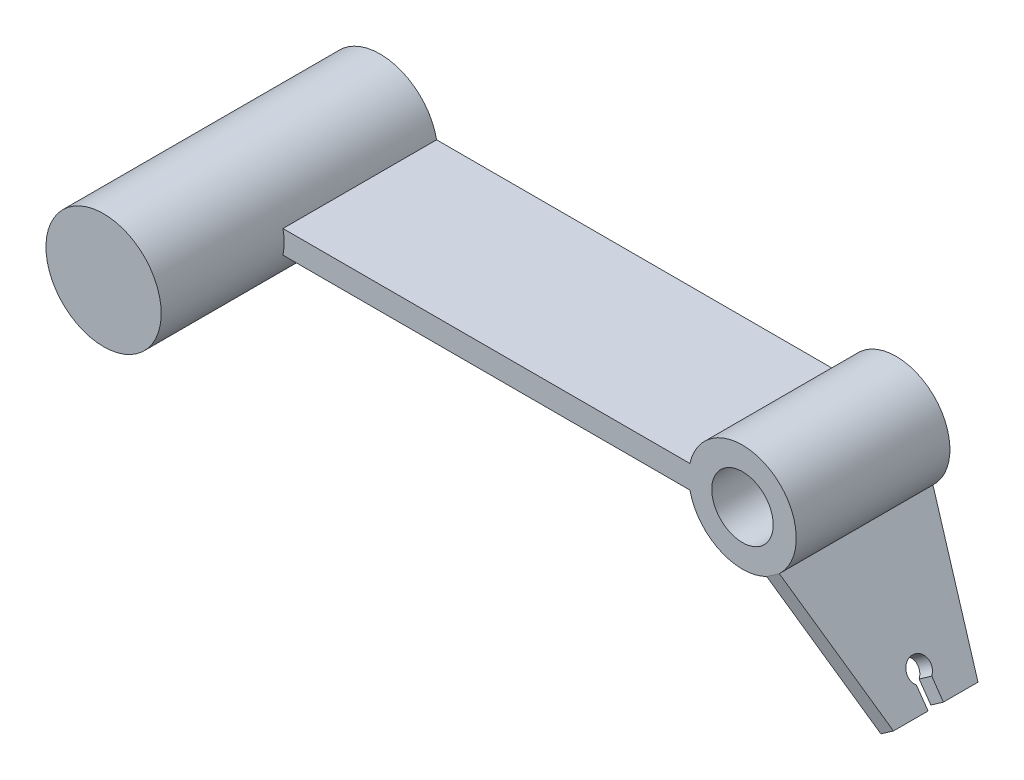
ISO-10303-21;
HEADER;
FILE_DESCRIPTION(('STEP AP214'),'2;1');
FILE_NAME('part.step','',(''),(''),'','','');
FILE_SCHEMA(('AUTOMOTIVE_DESIGN { 1 0 10303 214 1 1 1 1 }'));
ENDSEC;
DATA;
#1=APPLICATION_CONTEXT('core data for automotive mechanical design processes');
#2=APPLICATION_PROTOCOL_DEFINITION('international standard','automotive_design',2000,#1);
#3=PRODUCT_CONTEXT('',#1,'mechanical');
#4=PRODUCT('Part','Part','',(#3));
#5=PRODUCT_RELATED_PRODUCT_CATEGORY('part','',(#4));
#6=PRODUCT_DEFINITION_FORMATION('','',#4);
#7=PRODUCT_DEFINITION_CONTEXT('part definition',#1,'design');
#8=PRODUCT_DEFINITION('design','',#6,#7);
#9=PRODUCT_DEFINITION_SHAPE('','',#8);
#10=(LENGTH_UNIT() NAMED_UNIT(*) SI_UNIT(.MILLI.,.METRE.));
#11=(NAMED_UNIT(*) PLANE_ANGLE_UNIT() SI_UNIT($,.RADIAN.));
#12=(NAMED_UNIT(*) SI_UNIT($,.STERADIAN.) SOLID_ANGLE_UNIT());
#13=UNCERTAINTY_MEASURE_WITH_UNIT(LENGTH_MEASURE(1.E-05),#10,'distance_accuracy_value','');
#14=(GEOMETRIC_REPRESENTATION_CONTEXT(3) GLOBAL_UNCERTAINTY_ASSIGNED_CONTEXT((#13)) GLOBAL_UNIT_ASSIGNED_CONTEXT((#10,
#11,#12)) REPRESENTATION_CONTEXT('',''));
#15=CARTESIAN_POINT('',(0.,0.,0.));
#16=DIRECTION('',(0.,0.,1.));
#17=DIRECTION('',(1.,0.,0.));
#18=AXIS2_PLACEMENT_3D('',#15,#16,#17);
#19=CARTESIAN_POINT('',(-67.1626028344113,-1.5,20.));
#20=DIRECTION('',(0.,1.,0.));
#21=DIRECTION('',(-1.,0.,0.));
#22=AXIS2_PLACEMENT_3D('',#19,#20,#21);
#23=PLANE('',#22);
#24=DIRECTION('',(-1.,0.,0.));
#25=VECTOR('',#24,1.);
#26=CARTESIAN_POINT('',(-6.83739716558867,-1.5,11.));
#27=LINE('',#26,#25);
#28=CARTESIAN_POINT('',(-6.83739716558867,-1.5,11.));
#29=VERTEX_POINT('',#28);
#30=CARTESIAN_POINT('',(-25.2484276325332,-1.5,11.));
#31=VERTEX_POINT('',#30);
#32=EDGE_CURVE('E170',#29,#31,#27,.T.);
#33=ORIENTED_EDGE('',*,*,#32,.F.);
#34=DIRECTION('',(0.,0.,-1.));
#35=VECTOR('',#34,1.);
#36=CARTESIAN_POINT('',(-6.83739716558867,-1.5,20.));
#37=LINE('',#36,#35);
#38=CARTESIAN_POINT('',(-6.83739716558867,-1.5,20.));
#39=VERTEX_POINT('',#38);
#40=EDGE_CURVE('E279',#39,#29,#37,.T.);
#41=ORIENTED_EDGE('',*,*,#40,.F.);
#42=DIRECTION('',(1.,0.,0.));
#43=VECTOR('',#42,1.);
#44=CARTESIAN_POINT('',(-67.1626028344113,-1.5,20.));
#45=LINE('',#44,#43);
#46=CARTESIAN_POINT('',(-59.8141336060618,-1.5,20.));
#47=VERTEX_POINT('',#46);
#48=EDGE_CURVE('E268',#47,#39,#45,.T.);
#49=ORIENTED_EDGE('',*,*,#48,.F.);
#50=DIRECTION('',(0.,0.,-1.));
#51=VECTOR('',#50,1.);
#52=CARTESIAN_POINT('',(-59.8141336060618,-1.5,36.));
#53=LINE('',#52,#51);
#54=CARTESIAN_POINT('',(-59.8141336060618,-1.5,0.));
#55=VERTEX_POINT('',#54);
#56=EDGE_CURVE('E11',#55,#47,#53,.F.);
#57=ORIENTED_EDGE('',*,*,#56,.F.);
#58=DIRECTION('',(1.,0.,0.));
#59=VECTOR('',#58,1.);
#60=CARTESIAN_POINT('',(-67.1626028344113,-1.5,0.));
#61=LINE('',#60,#59);
#62=CARTESIAN_POINT('',(-6.83739716558867,-1.5,0.));
#63=VERTEX_POINT('',#62);
#64=EDGE_CURVE('E276',#55,#63,#61,.T.);
#65=ORIENTED_EDGE('',*,*,#64,.T.);
#66=CARTESIAN_POINT('',(-6.83739716558867,-1.5,9.00000000000001));
#67=VERTEX_POINT('',#66);
#68=EDGE_CURVE('E270',#67,#63,#37,.T.);
#69=ORIENTED_EDGE('',*,*,#68,.F.);
#70=DIRECTION('',(-1.,0.,0.));
#71=VECTOR('',#70,1.);
#72=CARTESIAN_POINT('',(-6.83739716558867,-1.5,9.00000000000001));
#73=LINE('',#72,#71);
#74=CARTESIAN_POINT('',(-25.2484276325332,-1.5,9.00000000000001));
#75=VERTEX_POINT('',#74);
#76=EDGE_CURVE('E58',#67,#75,#73,.T.);
#77=ORIENTED_EDGE('',*,*,#76,.T.);
#78=DIRECTION('',(0.,0.,-1.));
#79=VECTOR('',#78,1.);
#80=CARTESIAN_POINT('',(-25.2484276325332,-1.5,11.));
#81=LINE('',#80,#79);
#82=EDGE_CURVE('E53',#31,#75,#81,.T.);
#83=ORIENTED_EDGE('',*,*,#82,.F.);
#84=EDGE_LOOP('',(#33,#41,#49,#57,#65,#69,#77,#83));
#85=FACE_BOUND('',#84,.T.);
#86=ADVANCED_FACE('F38',(#85),#23,.F.);
#87=CARTESIAN_POINT('',(0.,0.,20.));
#88=DIRECTION('',(0.,0.,-1.));
#89=DIRECTION('',(-1.,0.,0.));
#90=AXIS2_PLACEMENT_3D('',#87,#88,#89);
#91=CYLINDRICAL_SURFACE('',#90,7.);
#92=CARTESIAN_POINT('',(0.,0.,11.));
#93=DIRECTION('',(0.,0.,-1.));
#94=DIRECTION('',(-1.,0.,0.));
#95=AXIS2_PLACEMENT_3D('',#92,#93,#94);
#96=CIRCLE('',#95,7.);
#97=CARTESIAN_POINT('',(3.15470207484822,-6.24882827568083,11.));
#98=VERTEX_POINT('',#97);
#99=EDGE_CURVE('E179',#98,#29,#96,.T.);
#100=ORIENTED_EDGE('',*,*,#99,.F.);
#101=DIRECTION('',(0.,0.,1.));
#102=VECTOR('',#101,1.);
#103=CARTESIAN_POINT('',(3.15470207484822,-6.24882827568083,-19.9629049680059));
#104=LINE('',#103,#102);
#105=CARTESIAN_POINT('',(3.15470207484822,-6.24882827568083,20.));
#106=VERTEX_POINT('',#105);
#107=EDGE_CURVE('E239',#98,#106,#104,.T.);
#108=ORIENTED_EDGE('',*,*,#107,.T.);
#109=CARTESIAN_POINT('',(0.,0.,20.));
#110=DIRECTION('',(0.,0.,1.));
#111=DIRECTION('',(1.,0.,0.));
#112=AXIS2_PLACEMENT_3D('',#109,#110,#111);
#113=CIRCLE('',#112,7.);
#114=EDGE_CURVE('E261',#39,#106,#113,.T.);
#115=ORIENTED_EDGE('',*,*,#114,.F.);
#116=ORIENTED_EDGE('',*,*,#40,.T.);
#117=EDGE_LOOP('',(#100,#108,#115,#116));
#118=FACE_BOUND('',#117,.T.);
#119=ADVANCED_FACE('F349',(#118),#91,.T.);
#120=CARTESIAN_POINT('',(13.5202588644871,-21.0523775435759,-19.9629049680059));
#121=DIRECTION('',(-0.819152044288993,-0.573576436351045,0.));
#122=DIRECTION('',(0.573576436351045,-0.819152044288993,0.));
#123=AXIS2_PLACEMENT_3D('',#120,#121,#122);
#124=PLANE('',#123);
#125=ORIENTED_EDGE('',*,*,#107,.F.);
#126=DIRECTION('',(-0.573576436351044,0.819152044288993,0.));
#127=VECTOR('',#126,1.);
#128=CARTESIAN_POINT('',(8.33748046966767,-13.6506029096284,11.));
#129=LINE('',#128,#127);
#130=CARTESIAN_POINT('',(8.33748046966767,-13.6506029096284,11.));
#131=VERTEX_POINT('',#130);
#132=EDGE_CURVE('E159',#131,#98,#129,.T.);
#133=ORIENTED_EDGE('',*,*,#132,.F.);
#134=DIRECTION('',(0.,0.,-1.));
#135=VECTOR('',#134,1.);
#136=CARTESIAN_POINT('',(8.33748046966767,-13.6506029096284,11.));
#137=LINE('',#136,#135);
#138=CARTESIAN_POINT('',(8.33748046966767,-13.6506029096284,9.00000000000001));
#139=VERTEX_POINT('',#138);
#140=EDGE_CURVE('E150',#131,#139,#137,.T.);
#141=ORIENTED_EDGE('',*,*,#140,.T.);
#142=DIRECTION('',(-0.573576436351044,0.819152044288993,0.));
#143=VECTOR('',#142,1.);
#144=CARTESIAN_POINT('',(8.33748046966767,-13.6506029096284,9.00000000000001));
#145=LINE('',#144,#143);
#146=CARTESIAN_POINT('',(3.15470207484822,-6.24882827568083,9.00000000000001));
#147=VERTEX_POINT('',#146);
#148=EDGE_CURVE('E156',#139,#147,#145,.T.);
#149=ORIENTED_EDGE('',*,*,#148,.T.);
#150=CARTESIAN_POINT('',(3.15470207484822,-6.24882827568083,0.));
#151=VERTEX_POINT('',#150);
#152=EDGE_CURVE('E237',#151,#147,#104,.T.);
#153=ORIENTED_EDGE('',*,*,#152,.F.);
#154=DIRECTION('',(0.556580706443766,-0.794879626498786,0.241628426704534));
#155=VECTOR('',#154,1.);
#156=CARTESIAN_POINT('',(13.5202588644871,-21.0523775435759,4.49999999999999));
#157=LINE('',#156,#155);
#158=CARTESIAN_POINT('',(13.5202588644871,-21.0523775435759,4.49999999999998));
#159=VERTEX_POINT('',#158);
#160=EDGE_CURVE('E184',#151,#159,#157,.T.);
#161=ORIENTED_EDGE('',*,*,#160,.T.);
#162=DIRECTION('',(0.,0.,1.));
#163=VECTOR('',#162,1.);
#164=CARTESIAN_POINT('',(13.5202588644871,-21.0523775435759,-19.9629049680059));
#165=LINE('',#164,#163);
#166=CARTESIAN_POINT('',(13.5202588644871,-21.0523775435759,9.));
#167=VERTEX_POINT('',#166);
#168=EDGE_CURVE('E234',#159,#167,#165,.T.);
#169=ORIENTED_EDGE('',*,*,#168,.T.);
#170=DIRECTION('',(0.573576436351045,-0.819152044288993,0.));
#171=VECTOR('',#170,1.);
#172=CARTESIAN_POINT('',(11.9981230656547,-18.8785423364825,9.));
#173=LINE('',#172,#171);
#174=CARTESIAN_POINT('',(11.9981230656547,-18.8785423364825,9.));
#175=VERTEX_POINT('',#174);
#176=EDGE_CURVE('E202',#175,#167,#173,.T.);
#177=ORIENTED_EDGE('',*,*,#176,.F.);
#178=CARTESIAN_POINT('',(11.3568451146682,-17.9627025090134,10.));
#179=DIRECTION('',(-0.819152044288993,-0.573576436351045,0.));
#180=DIRECTION('',(0.573576436351045,-0.819152044288993,0.));
#181=AXIS2_PLACEMENT_3D('',#178,#179,#180);
#182=CIRCLE('',#181,1.5);
#183=CARTESIAN_POINT('',(11.9981230656547,-18.8785423364825,11.));
#184=VERTEX_POINT('',#183);
#185=EDGE_CURVE('E208',#175,#184,#182,.F.);
#186=ORIENTED_EDGE('',*,*,#185,.T.);
#187=DIRECTION('',(0.573576436351045,-0.819152044288993,0.));
#188=VECTOR('',#187,1.);
#189=CARTESIAN_POINT('',(11.9981230656547,-18.8785423364825,11.));
#190=LINE('',#189,#188);
#191=CARTESIAN_POINT('',(13.5202588644871,-21.0523775435759,11.));
#192=VERTEX_POINT('',#191);
#193=EDGE_CURVE('E219',#184,#192,#190,.T.);
#194=ORIENTED_EDGE('',*,*,#193,.T.);
#195=CARTESIAN_POINT('',(13.5202588644871,-21.0523775435759,15.5));
#196=VERTEX_POINT('',#195);
#197=EDGE_CURVE('E236',#192,#196,#165,.T.);
#198=ORIENTED_EDGE('',*,*,#197,.T.);
#199=DIRECTION('',(-0.556580706443766,0.794879626498786,0.241628426704534));
#200=VECTOR('',#199,1.);
#201=CARTESIAN_POINT('',(3.15470207484821,-6.24882827568081,20.));
#202=LINE('',#201,#200);
#203=EDGE_CURVE('E195',#196,#106,#202,.T.);
#204=ORIENTED_EDGE('',*,*,#203,.T.);
#205=EDGE_LOOP('',(#125,#133,#141,#149,#153,#161,#169,#177,#186,#194,#198,#204));
#206=FACE_BOUND('',#205,.T.);
#207=ADVANCED_FACE('F153',(#206),#124,.T.);
#208=CARTESIAN_POINT('',(15.1585629530651,-19.9052246708738,-19.9629049680059));
#209=DIRECTION('',(0.573576436351044,-0.819152044288993,0.));
#210=DIRECTION('',(0.819152044288993,0.573576436351044,0.));
#211=AXIS2_PLACEMENT_3D('',#208,#209,#210);
#212=PLANE('',#211);
#213=DIRECTION('',(0.819152044288993,0.573576436351044,0.));
#214=VECTOR('',#213,1.);
#215=CARTESIAN_POINT('',(-45.6524703399068,-62.4855685889341,4.5));
#216=LINE('',#215,#214);
#217=CARTESIAN_POINT('',(15.1585629530651,-19.9052246708738,4.5));
#218=VERTEX_POINT('',#217);
#219=EDGE_CURVE('E189',#159,#218,#216,.T.);
#220=ORIENTED_EDGE('',*,*,#219,.T.);
#221=DIRECTION('',(0.,0.,1.));
#222=VECTOR('',#221,1.);
#223=CARTESIAN_POINT('',(15.1585629530651,-19.9052246708738,-19.9629049680059));
#224=LINE('',#223,#222);
#225=CARTESIAN_POINT('',(15.1585629530651,-19.9052246708738,9.));
#226=VERTEX_POINT('',#225);
#227=EDGE_CURVE('E230',#218,#226,#224,.T.);
#228=ORIENTED_EDGE('',*,*,#227,.T.);
#229=DIRECTION('',(0.819152044288993,0.573576436351044,0.));
#230=VECTOR('',#229,1.);
#231=CARTESIAN_POINT('',(8.55158741351989,-24.5314787484305,9.));
#232=LINE('',#231,#230);
#233=EDGE_CURVE('E223',#167,#226,#232,.T.);
#234=ORIENTED_EDGE('',*,*,#233,.F.);
#235=ORIENTED_EDGE('',*,*,#168,.F.);
#236=EDGE_LOOP('',(#220,#228,#234,#235));
#237=FACE_BOUND('',#236,.T.);
#238=ADVANCED_FACE('F327',(#237),#212,.T.);
#239=CARTESIAN_POINT('',(4.79300616342621,-5.10167540297874,20.));
#240=VERTEX_POINT('',#239);
#241=CARTESIAN_POINT('',(-6.83739716558867,1.5,20.));
#242=VERTEX_POINT('',#241);
#243=EDGE_CURVE('E265',#240,#242,#113,.T.);
#244=ORIENTED_EDGE('',*,*,#243,.F.);
#245=DIRECTION('',(0.,0.,1.));
#246=VECTOR('',#245,1.);
#247=CARTESIAN_POINT('',(4.79300616342621,-5.10167540297874,-19.9629049680059));
#248=LINE('',#247,#246);
#249=CARTESIAN_POINT('',(4.79300616342622,-5.10167540297874,0.));
#250=VERTEX_POINT('',#249);
#251=EDGE_CURVE('E212',#250,#240,#248,.T.);
#252=ORIENTED_EDGE('',*,*,#251,.F.);
#253=CARTESIAN_POINT('',(0.,0.,0.));
#254=DIRECTION('',(0.,0.,1.));
#255=DIRECTION('',(1.,0.,0.));
#256=AXIS2_PLACEMENT_3D('',#253,#254,#255);
#257=CIRCLE('',#256,7.);
#258=CARTESIAN_POINT('',(-6.83739716558867,1.5,0.));
#259=VERTEX_POINT('',#258);
#260=EDGE_CURVE('E257',#250,#259,#257,.T.);
#261=ORIENTED_EDGE('',*,*,#260,.T.);
#262=DIRECTION('',(0.,0.,-1.));
#263=VECTOR('',#262,1.);
#264=CARTESIAN_POINT('',(-6.83739716558867,1.5,20.));
#265=LINE('',#264,#263);
#266=EDGE_CURVE('E46',#242,#259,#265,.T.);
#267=ORIENTED_EDGE('',*,*,#266,.F.);
#268=EDGE_LOOP('',(#244,#252,#261,#267));
#269=FACE_BOUND('',#268,.T.);
#270=ADVANCED_FACE('F289',(#269),#91,.T.);
#271=CARTESIAN_POINT('',(0.,0.,20.));
#272=DIRECTION('',(0.,0.,1.));
#273=DIRECTION('',(1.,0.,0.));
#274=AXIS2_PLACEMENT_3D('',#271,#272,#273);
#275=PLANE('',#274);
#276=DIRECTION('',(0.819152044288993,0.573576436351044,0.));
#277=VECTOR('',#276,1.);
#278=CARTESIAN_POINT('',(-56.0180271295457,-47.6820193210391,20.));
#279=LINE('',#278,#277);
#280=EDGE_CURVE('E192',#106,#240,#279,.T.);
#281=ORIENTED_EDGE('',*,*,#280,.T.);
#282=ORIENTED_EDGE('',*,*,#243,.T.);
#283=DIRECTION('',(-1.,0.,0.));
#284=VECTOR('',#283,1.);
#285=CARTESIAN_POINT('',(-67.1626028344113,1.5,20.));
#286=LINE('',#285,#284);
#287=CARTESIAN_POINT('',(-59.8141336060618,1.5,20.));
#288=VERTEX_POINT('',#287);
#289=EDGE_CURVE('E264',#242,#288,#286,.T.);
#290=ORIENTED_EDGE('',*,*,#289,.T.);
#291=CARTESIAN_POINT('',(-67.1626028344113,0.,20.));
#292=DIRECTION('',(0.,0.,1.));
#293=DIRECTION('',(1.,0.,0.));
#294=AXIS2_PLACEMENT_3D('',#291,#292,#293);
#295=CIRCLE('',#294,7.5);
#296=EDGE_CURVE('E247',#288,#47,#295,.F.);
#297=ORIENTED_EDGE('',*,*,#296,.T.);
#298=ORIENTED_EDGE('',*,*,#48,.T.);
#299=ORIENTED_EDGE('',*,*,#114,.T.);
#300=EDGE_LOOP('',(#281,#282,#290,#297,#298,#299));
#301=FACE_BOUND('',#300,.T.);
#302=CARTESIAN_POINT('',(0.,0.,20.));
#303=DIRECTION('',(0.,0.,1.));
#304=DIRECTION('',(1.,0.,0.));
#305=AXIS2_PLACEMENT_3D('',#302,#303,#304);
#306=CIRCLE('',#305,4.);
#307=CARTESIAN_POINT('',(4.,0.,20.));
#308=VERTEX_POINT('',#307);
#309=EDGE_CURVE('E253',#308,#308,#306,.T.);
#310=ORIENTED_EDGE('',*,*,#309,.F.);
#311=EDGE_LOOP('',(#310));
#312=FACE_BOUND('',#311,.T.);
#313=ADVANCED_FACE('F303',(#301,#312),#275,.T.);
#314=CARTESIAN_POINT('',(-67.1626028344113,1.5,20.));
#315=DIRECTION('',(0.,-1.,0.));
#316=DIRECTION('',(1.,0.,0.));
#317=AXIS2_PLACEMENT_3D('',#314,#315,#316);
#318=PLANE('',#317);
#319=DIRECTION('',(0.,0.,-1.));
#320=VECTOR('',#319,1.);
#321=CARTESIAN_POINT('',(-59.8141336060618,1.5,36.));
#322=LINE('',#321,#320);
#323=CARTESIAN_POINT('',(-59.8141336060618,1.5,0.));
#324=VERTEX_POINT('',#323);
#325=EDGE_CURVE('E249',#288,#324,#322,.T.);
#326=ORIENTED_EDGE('',*,*,#325,.F.);
#327=ORIENTED_EDGE('',*,*,#289,.F.);
#328=ORIENTED_EDGE('',*,*,#266,.T.);
#329=DIRECTION('',(-1.,0.,0.));
#330=VECTOR('',#329,1.);
#331=CARTESIAN_POINT('',(-67.1626028344113,1.5,0.));
#332=LINE('',#331,#330);
#333=EDGE_CURVE('E274',#259,#324,#332,.T.);
#334=ORIENTED_EDGE('',*,*,#333,.T.);
#335=EDGE_LOOP('',(#326,#327,#328,#334));
#336=FACE_BOUND('',#335,.T.);
#337=ADVANCED_FACE('F285',(#336),#318,.F.);
#338=CARTESIAN_POINT('',(0.,0.,0.));
#339=DIRECTION('',(0.,0.,1.));
#340=DIRECTION('',(1.,0.,0.));
#341=AXIS2_PLACEMENT_3D('',#338,#339,#340);
#342=PLANE('',#341);
#343=ORIENTED_EDGE('',*,*,#260,.F.);
#344=DIRECTION('',(0.819152044288993,0.573576436351044,0.));
#345=VECTOR('',#344,1.);
#346=CARTESIAN_POINT('',(-56.0180271295457,-47.6820193210391,0.));
#347=LINE('',#346,#345);
#348=EDGE_CURVE('E182',#151,#250,#347,.T.);
#349=ORIENTED_EDGE('',*,*,#348,.F.);
#350=EDGE_CURVE('E271',#63,#151,#257,.T.);
#351=ORIENTED_EDGE('',*,*,#350,.F.);
#352=ORIENTED_EDGE('',*,*,#64,.F.);
#353=CARTESIAN_POINT('',(-67.1626028344113,0.,0.));
#354=DIRECTION('',(0.,0.,1.));
#355=DIRECTION('',(1.,0.,0.));
#356=AXIS2_PLACEMENT_3D('',#353,#354,#355);
#357=CIRCLE('',#356,7.5);
#358=EDGE_CURVE('E232',#324,#55,#357,.T.);
#359=ORIENTED_EDGE('',*,*,#358,.F.);
#360=ORIENTED_EDGE('',*,*,#333,.F.);
#361=EDGE_LOOP('',(#343,#349,#351,#352,#359,#360));
#362=FACE_BOUND('',#361,.T.);
#363=CARTESIAN_POINT('',(0.,0.,0.));
#364=DIRECTION('',(0.,0.,1.));
#365=DIRECTION('',(1.,0.,0.));
#366=AXIS2_PLACEMENT_3D('',#363,#364,#365);
#367=CIRCLE('',#366,4.);
#368=CARTESIAN_POINT('',(4.,0.,0.));
#369=VERTEX_POINT('',#368);
#370=EDGE_CURVE('E252',#369,#369,#367,.T.);
#371=ORIENTED_EDGE('',*,*,#370,.T.);
#372=EDGE_LOOP('',(#371));
#373=FACE_BOUND('',#372,.T.);
#374=ADVANCED_FACE('F295',(#362,#373),#342,.F.);
#375=ORIENTED_EDGE('',*,*,#152,.T.);
#376=CARTESIAN_POINT('',(0.,0.,9.00000000000001));
#377=DIRECTION('',(0.,0.,-1.));
#378=DIRECTION('',(-1.,0.,0.));
#379=AXIS2_PLACEMENT_3D('',#376,#377,#378);
#380=CIRCLE('',#379,7.);
#381=EDGE_CURVE('E169',#147,#67,#380,.T.);
#382=ORIENTED_EDGE('',*,*,#381,.T.);
#383=ORIENTED_EDGE('',*,*,#68,.T.);
#384=ORIENTED_EDGE('',*,*,#350,.T.);
#385=EDGE_LOOP('',(#375,#382,#383,#384));
#386=FACE_BOUND('',#385,.T.);
#387=ADVANCED_FACE('F40',(#386),#91,.T.);
#388=CARTESIAN_POINT('',(0.,0.,20.));
#389=DIRECTION('',(0.,0.,-1.));
#390=DIRECTION('',(-1.,0.,0.));
#391=AXIS2_PLACEMENT_3D('',#388,#389,#390);
#392=CYLINDRICAL_SURFACE('',#391,4.);
#393=ORIENTED_EDGE('',*,*,#309,.T.);
#394=EDGE_LOOP('',(#393));
#395=FACE_BOUND('',#394,.T.);
#396=ORIENTED_EDGE('',*,*,#370,.F.);
#397=EDGE_LOOP('',(#396));
#398=FACE_BOUND('',#397,.T.);
#399=ADVANCED_FACE('F366',(#395,#398),#392,.F.);
#400=CARTESIAN_POINT('',(-67.1626028344113,0.,36.));
#401=DIRECTION('',(0.,0.,-1.));
#402=DIRECTION('',(-1.,0.,0.));
#403=AXIS2_PLACEMENT_3D('',#400,#401,#402);
#404=CYLINDRICAL_SURFACE('',#403,7.5);
#405=CARTESIAN_POINT('',(-67.1626028344113,0.,36.));
#406=DIRECTION('',(0.,0.,1.));
#407=DIRECTION('',(1.,0.,0.));
#408=AXIS2_PLACEMENT_3D('',#405,#406,#407);
#409=CIRCLE('',#408,7.5);
#410=CARTESIAN_POINT('',(-59.6626028344113,0.,36.));
#411=VERTEX_POINT('',#410);
#412=EDGE_CURVE('E244',#411,#411,#409,.T.);
#413=ORIENTED_EDGE('',*,*,#412,.F.);
#414=EDGE_LOOP('',(#413));
#415=FACE_BOUND('',#414,.T.);
#416=ORIENTED_EDGE('',*,*,#296,.F.);
#417=ORIENTED_EDGE('',*,*,#325,.T.);
#418=ORIENTED_EDGE('',*,*,#358,.T.);
#419=ORIENTED_EDGE('',*,*,#56,.T.);
#420=EDGE_LOOP('',(#416,#417,#418,#419));
#421=FACE_BOUND('',#420,.T.);
#422=ADVANCED_FACE('F301',(#415,#421),#404,.T.);
#423=CARTESIAN_POINT('',(-67.1626028344113,0.,36.));
#424=DIRECTION('',(0.,0.,1.));
#425=DIRECTION('',(1.,0.,0.));
#426=AXIS2_PLACEMENT_3D('',#423,#424,#425);
#427=PLANE('',#426);
#428=ORIENTED_EDGE('',*,*,#412,.T.);
#429=EDGE_LOOP('',(#428));
#430=FACE_BOUND('',#429,.T.);
#431=ADVANCED_FACE('F372',(#430),#427,.T.);
#432=CARTESIAN_POINT('',(15.1585629530651,-19.9052246708738,-19.9629049680059));
#433=DIRECTION('',(0.819152044288993,0.573576436351044,0.));
#434=DIRECTION('',(-0.573576436351044,0.819152044288993,0.));
#435=AXIS2_PLACEMENT_3D('',#432,#433,#434);
#436=PLANE('',#435);
#437=DIRECTION('',(0.556580706443766,-0.794879626498786,0.241628426704534));
#438=VECTOR('',#437,1.);
#439=CARTESIAN_POINT('',(15.1585629530651,-19.9052246708738,4.5));
#440=LINE('',#439,#438);
#441=EDGE_CURVE('E187',#250,#218,#440,.T.);
#442=ORIENTED_EDGE('',*,*,#441,.F.);
#443=ORIENTED_EDGE('',*,*,#251,.T.);
#444=DIRECTION('',(-0.556580706443766,0.794879626498786,0.241628426704534));
#445=VECTOR('',#444,1.);
#446=CARTESIAN_POINT('',(4.79300616342622,-5.10167540297874,20.));
#447=LINE('',#446,#445);
#448=CARTESIAN_POINT('',(15.1585629530651,-19.9052246708738,15.5));
#449=VERTEX_POINT('',#448);
#450=EDGE_CURVE('E198',#449,#240,#447,.T.);
#451=ORIENTED_EDGE('',*,*,#450,.F.);
#452=CARTESIAN_POINT('',(15.1585629530651,-19.9052246708738,11.));
#453=VERTEX_POINT('',#452);
#454=EDGE_CURVE('E233',#453,#449,#224,.T.);
#455=ORIENTED_EDGE('',*,*,#454,.F.);
#456=DIRECTION('',(0.573576436351044,-0.819152044288993,0.));
#457=VECTOR('',#456,1.);
#458=CARTESIAN_POINT('',(13.6364271542327,-17.7313894637804,11.));
#459=LINE('',#458,#457);
#460=CARTESIAN_POINT('',(13.6364271542327,-17.7313894637804,11.));
#461=VERTEX_POINT('',#460);
#462=EDGE_CURVE('E206',#461,#453,#459,.T.);
#463=ORIENTED_EDGE('',*,*,#462,.F.);
#464=CARTESIAN_POINT('',(12.9951492032462,-16.8155496363113,10.));
#465=DIRECTION('',(0.819152044288993,0.573576436351044,0.));
#466=DIRECTION('',(-0.573576436351044,0.819152044288993,0.));
#467=AXIS2_PLACEMENT_3D('',#464,#465,#466);
#468=CIRCLE('',#467,1.5);
#469=CARTESIAN_POINT('',(13.6364271542327,-17.7313894637804,9.));
#470=VERTEX_POINT('',#469);
#471=EDGE_CURVE('E203',#470,#461,#468,.T.);
#472=ORIENTED_EDGE('',*,*,#471,.F.);
#473=DIRECTION('',(0.573576436351045,-0.819152044288993,0.));
#474=VECTOR('',#473,1.);
#475=CARTESIAN_POINT('',(13.6364271542327,-17.7313894637804,9.));
#476=LINE('',#475,#474);
#477=EDGE_CURVE('E209',#470,#226,#476,.T.);
#478=ORIENTED_EDGE('',*,*,#477,.T.);
#479=ORIENTED_EDGE('',*,*,#227,.F.);
#480=EDGE_LOOP('',(#442,#443,#451,#455,#463,#472,#478,#479));
#481=FACE_BOUND('',#480,.T.);
#482=ADVANCED_FACE('F320',(#481),#436,.T.);
#483=DIRECTION('',(0.819152044288993,0.573576436351044,0.));
#484=VECTOR('',#483,1.);
#485=CARTESIAN_POINT('',(-45.6524703399068,-62.4855685889341,15.5));
#486=LINE('',#485,#484);
#487=EDGE_CURVE('E200',#196,#449,#486,.T.);
#488=ORIENTED_EDGE('',*,*,#487,.F.);
#489=ORIENTED_EDGE('',*,*,#197,.F.);
#490=DIRECTION('',(0.819152044288993,0.573576436351044,0.));
#491=VECTOR('',#490,1.);
#492=CARTESIAN_POINT('',(8.55158741351989,-24.5314787484305,11.));
#493=LINE('',#492,#491);
#494=EDGE_CURVE('E222',#192,#453,#493,.T.);
#495=ORIENTED_EDGE('',*,*,#494,.T.);
#496=ORIENTED_EDGE('',*,*,#454,.T.);
#497=EDGE_LOOP('',(#488,#489,#495,#496));
#498=FACE_BOUND('',#497,.T.);
#499=ADVANCED_FACE('F315',(#498),#212,.T.);
#500=CARTESIAN_POINT('',(6.38817366370093,-21.441803713868,10.));
#501=DIRECTION('',(0.819152044288993,0.573576436351044,0.));
#502=DIRECTION('',(-0.573576436351044,0.819152044288993,0.));
#503=AXIS2_PLACEMENT_3D('',#500,#501,#502);
#504=CYLINDRICAL_SURFACE('',#503,1.5);
#505=DIRECTION('',(0.819152044288993,0.573576436351044,0.));
#506=VECTOR('',#505,1.);
#507=CARTESIAN_POINT('',(7.02945161468744,-22.3576435413371,9.));
#508=LINE('',#507,#506);
#509=EDGE_CURVE('E213',#175,#470,#508,.T.);
#510=ORIENTED_EDGE('',*,*,#509,.T.);
#511=ORIENTED_EDGE('',*,*,#471,.T.);
#512=DIRECTION('',(0.819152044288993,0.573576436351044,0.));
#513=VECTOR('',#512,1.);
#514=CARTESIAN_POINT('',(7.02945161468744,-22.3576435413371,11.));
#515=LINE('',#514,#513);
#516=EDGE_CURVE('E216',#184,#461,#515,.T.);
#517=ORIENTED_EDGE('',*,*,#516,.F.);
#518=ORIENTED_EDGE('',*,*,#185,.F.);
#519=EDGE_LOOP('',(#510,#511,#517,#518));
#520=FACE_BOUND('',#519,.T.);
#521=ADVANCED_FACE('F337',(#520),#504,.F.);
#522=CARTESIAN_POINT('',(7.02945161468744,-22.3576435413371,11.));
#523=DIRECTION('',(0.,0.,1.));
#524=DIRECTION('',(1.,0.,0.));
#525=AXIS2_PLACEMENT_3D('',#522,#523,#524);
#526=PLANE('',#525);
#527=ORIENTED_EDGE('',*,*,#516,.T.);
#528=ORIENTED_EDGE('',*,*,#462,.T.);
#529=ORIENTED_EDGE('',*,*,#494,.F.);
#530=ORIENTED_EDGE('',*,*,#193,.F.);
#531=EDGE_LOOP('',(#527,#528,#529,#530));
#532=FACE_BOUND('',#531,.T.);
#533=ADVANCED_FACE('F339',(#532),#526,.F.);
#534=CARTESIAN_POINT('',(7.02945161468744,-22.3576435413371,9.));
#535=DIRECTION('',(0.,0.,1.));
#536=DIRECTION('',(0.,-1.,0.));
#537=AXIS2_PLACEMENT_3D('',#534,#535,#536);
#538=PLANE('',#537);
#539=ORIENTED_EDGE('',*,*,#176,.T.);
#540=ORIENTED_EDGE('',*,*,#233,.T.);
#541=ORIENTED_EDGE('',*,*,#477,.F.);
#542=ORIENTED_EDGE('',*,*,#509,.F.);
#543=EDGE_LOOP('',(#539,#540,#541,#542));
#544=FACE_BOUND('',#543,.T.);
#545=ADVANCED_FACE('F331',(#544),#538,.T.);
#546=CARTESIAN_POINT('',(-56.0180271295457,-47.6820193210391,20.));
#547=DIRECTION('',(-0.138592371910296,0.197930419693352,-0.970368849153914));
#548=DIRECTION('',(0.,0.979824635770892,0.199859158250099));
#549=AXIS2_PLACEMENT_3D('',#546,#547,#548);
#550=PLANE('',#549);
#551=ORIENTED_EDGE('',*,*,#487,.T.);
#552=ORIENTED_EDGE('',*,*,#450,.T.);
#553=ORIENTED_EDGE('',*,*,#280,.F.);
#554=ORIENTED_EDGE('',*,*,#203,.F.);
#555=EDGE_LOOP('',(#551,#552,#553,#554));
#556=FACE_BOUND('',#555,.T.);
#557=ADVANCED_FACE('F309',(#556),#550,.F.);
#558=CARTESIAN_POINT('',(-45.6524703399068,-62.4855685889341,4.5));
#559=DIRECTION('',(-0.138592371910296,0.197930419693352,0.970368849153914));
#560=DIRECTION('',(0.,-0.979824635770892,0.199859158250099));
#561=AXIS2_PLACEMENT_3D('',#558,#559,#560);
#562=PLANE('',#561);
#563=ORIENTED_EDGE('',*,*,#348,.T.);
#564=ORIENTED_EDGE('',*,*,#441,.T.);
#565=ORIENTED_EDGE('',*,*,#219,.F.);
#566=ORIENTED_EDGE('',*,*,#160,.F.);
#567=EDGE_LOOP('',(#563,#564,#565,#566));
#568=FACE_BOUND('',#567,.T.);
#569=ADVANCED_FACE('F324',(#568),#562,.F.);
#570=CARTESIAN_POINT('',(0.,0.,11.));
#571=DIRECTION('',(0.,0.,-1.));
#572=DIRECTION('',(-1.,0.,0.));
#573=AXIS2_PLACEMENT_3D('',#570,#571,#572);
#574=PLANE('',#573);
#575=ORIENTED_EDGE('',*,*,#132,.T.);
#576=ORIENTED_EDGE('',*,*,#99,.T.);
#577=ORIENTED_EDGE('',*,*,#32,.T.);
#578=DIRECTION('',(0.940353758988587,-0.340198189230975,0.));
#579=VECTOR('',#578,1.);
#580=CARTESIAN_POINT('',(-25.2484276325332,-1.5,11.));
#581=LINE('',#580,#579);
#582=EDGE_CURVE('E173',#31,#131,#581,.T.);
#583=ORIENTED_EDGE('',*,*,#582,.T.);
#584=EDGE_LOOP('',(#575,#576,#577,#583));
#585=FACE_BOUND('',#584,.T.);
#586=ADVANCED_FACE('F435',(#585),#574,.F.);
#587=CARTESIAN_POINT('',(0.,0.,9.00000000000001));
#588=DIRECTION('',(0.,0.,-1.));
#589=DIRECTION('',(-1.,0.,0.));
#590=AXIS2_PLACEMENT_3D('',#587,#588,#589);
#591=PLANE('',#590);
#592=ORIENTED_EDGE('',*,*,#381,.F.);
#593=ORIENTED_EDGE('',*,*,#148,.F.);
#594=DIRECTION('',(0.940353758988587,-0.340198189230975,0.));
#595=VECTOR('',#594,1.);
#596=CARTESIAN_POINT('',(-25.2484276325332,-1.5,9.00000000000001));
#597=LINE('',#596,#595);
#598=EDGE_CURVE('E163',#75,#139,#597,.T.);
#599=ORIENTED_EDGE('',*,*,#598,.F.);
#600=ORIENTED_EDGE('',*,*,#76,.F.);
#601=EDGE_LOOP('',(#592,#593,#599,#600));
#602=FACE_BOUND('',#601,.T.);
#603=ADVANCED_FACE('F168',(#602),#591,.T.);
#604=CARTESIAN_POINT('',(-25.2484276325332,-1.5,11.));
#605=DIRECTION('',(0.340198189230975,0.940353758988587,0.));
#606=DIRECTION('',(-0.940353758988587,0.340198189230975,0.));
#607=AXIS2_PLACEMENT_3D('',#604,#605,#606);
#608=PLANE('',#607);
#609=ORIENTED_EDGE('',*,*,#598,.T.);
#610=ORIENTED_EDGE('',*,*,#140,.F.);
#611=ORIENTED_EDGE('',*,*,#582,.F.);
#612=ORIENTED_EDGE('',*,*,#82,.T.);
#613=EDGE_LOOP('',(#609,#610,#611,#612));
#614=FACE_BOUND('',#613,.T.);
#615=ADVANCED_FACE('F164',(#614),#608,.F.);
#616=CLOSED_SHELL('',(#86,#119,#207,#238,#270,#313,#337,#374,#387,#399,#422,#431,#482,#499,#521,
#533,#545,#557,#569,#586,#603,#615));
#617=MANIFOLD_SOLID_BREP('B2',#616);
#618=ADVANCED_BREP_SHAPE_REPRESENTATION('',(#18,#617),#14);
#619=SHAPE_DEFINITION_REPRESENTATION(#9,#618);
ENDSEC;
END-ISO-10303-21;
